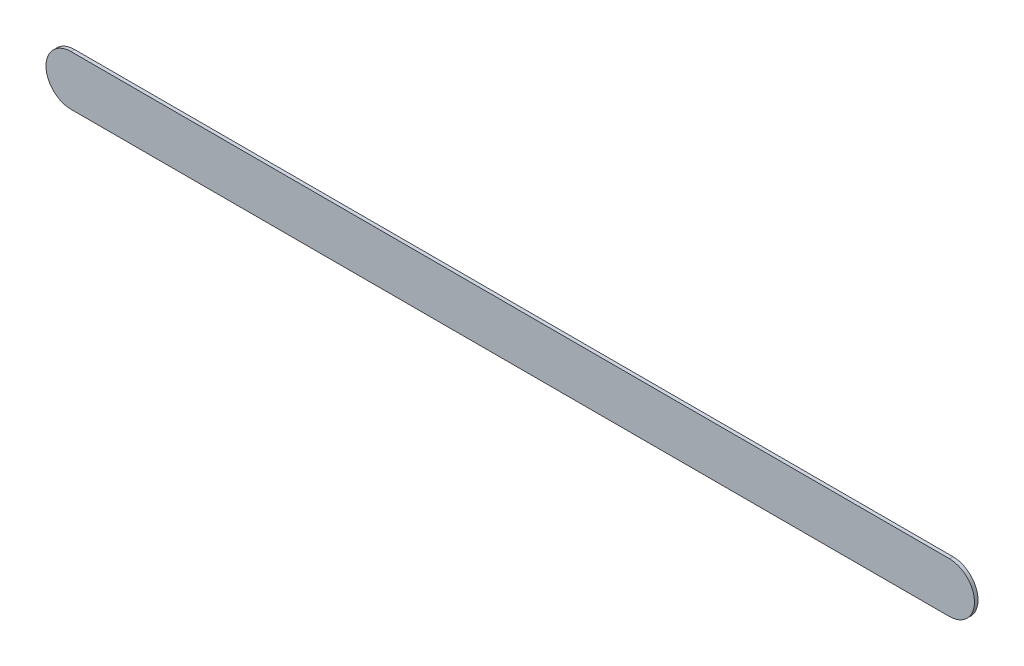
ISO-10303-21;
HEADER;
FILE_DESCRIPTION(('STEP AP214'),'2;1');
FILE_NAME('part.step','',(''),(''),'','','');
FILE_SCHEMA(('AUTOMOTIVE_DESIGN { 1 0 10303 214 1 1 1 1 }'));
ENDSEC;
DATA;
#1=APPLICATION_CONTEXT('core data for automotive mechanical design processes');
#2=APPLICATION_PROTOCOL_DEFINITION('international standard','automotive_design',2000,#1);
#3=PRODUCT_CONTEXT('',#1,'mechanical');
#4=PRODUCT('Part','Part','',(#3));
#5=PRODUCT_RELATED_PRODUCT_CATEGORY('part','',(#4));
#6=PRODUCT_DEFINITION_FORMATION('','',#4);
#7=PRODUCT_DEFINITION_CONTEXT('part definition',#1,'design');
#8=PRODUCT_DEFINITION('design','',#6,#7);
#9=PRODUCT_DEFINITION_SHAPE('','',#8);
#10=(LENGTH_UNIT() NAMED_UNIT(*) SI_UNIT(.MILLI.,.METRE.));
#11=(NAMED_UNIT(*) PLANE_ANGLE_UNIT() SI_UNIT($,.RADIAN.));
#12=(NAMED_UNIT(*) SI_UNIT($,.STERADIAN.) SOLID_ANGLE_UNIT());
#13=UNCERTAINTY_MEASURE_WITH_UNIT(LENGTH_MEASURE(1.E-05),#10,'distance_accuracy_value','');
#14=(GEOMETRIC_REPRESENTATION_CONTEXT(3) GLOBAL_UNCERTAINTY_ASSIGNED_CONTEXT((#13)) GLOBAL_UNIT_ASSIGNED_CONTEXT((#10,
#11,#12)) REPRESENTATION_CONTEXT('',''));
#15=CARTESIAN_POINT('',(0.,0.,0.));
#16=DIRECTION('',(0.,0.,1.));
#17=DIRECTION('',(1.,0.,0.));
#18=AXIS2_PLACEMENT_3D('',#15,#16,#17);
#19=CARTESIAN_POINT('',(92.54500414,105.33201184,0.));
#20=DIRECTION('',(0.,1.,0.));
#21=DIRECTION('',(1.,0.,0.));
#22=AXIS2_PLACEMENT_3D('',#19,#20,#21);
#23=PLANE('',#22);
#24=DIRECTION('',(1.,0.,0.));
#25=VECTOR('',#24,1.);
#26=CARTESIAN_POINT('',(92.54500414,105.33201184,0.03556));
#27=LINE('',#26,#25);
#28=CARTESIAN_POINT('',(92.54500414,105.33201184,0.03556));
#29=VERTEX_POINT('',#28);
#30=CARTESIAN_POINT('',(101.31798888,105.33201184,0.03556));
#31=VERTEX_POINT('',#30);
#32=EDGE_CURVE('E11',#29,#31,#27,.T.);
#33=ORIENTED_EDGE('',*,*,#32,.F.);
#34=DIRECTION('',(0.,0.,1.));
#35=VECTOR('',#34,1.);
#36=CARTESIAN_POINT('',(92.54500414,105.33201184,0.));
#37=LINE('',#36,#35);
#38=CARTESIAN_POINT('',(92.54500414,105.33201184,0.));
#39=VERTEX_POINT('',#38);
#40=EDGE_CURVE('E24',#39,#29,#37,.T.);
#41=ORIENTED_EDGE('',*,*,#40,.F.);
#42=DIRECTION('',(1.,0.,0.));
#43=VECTOR('',#42,1.);
#44=CARTESIAN_POINT('',(92.54500414,105.33201184,0.));
#45=LINE('',#44,#43);
#46=CARTESIAN_POINT('',(101.31798888,105.33201184,0.));
#47=VERTEX_POINT('',#46);
#48=EDGE_CURVE('E75',#39,#47,#45,.T.);
#49=ORIENTED_EDGE('',*,*,#48,.T.);
#50=DIRECTION('',(0.,0.,1.));
#51=VECTOR('',#50,1.);
#52=CARTESIAN_POINT('',(101.31798888,105.33201184,0.));
#53=LINE('',#52,#51);
#54=EDGE_CURVE('E37',#47,#31,#53,.T.);
#55=ORIENTED_EDGE('',*,*,#54,.T.);
#56=EDGE_LOOP('',(#33,#41,#49,#55));
#57=FACE_BOUND('',#56,.T.);
#58=ADVANCED_FACE('F17',(#57),#23,.F.);
#59=CARTESIAN_POINT('',(101.31798888,105.58201134,0.));
#60=DIRECTION('',(0.,0.,-1.));
#61=DIRECTION('',(0.,-1.,0.));
#62=AXIS2_PLACEMENT_3D('',#59,#60,#61);
#63=CYLINDRICAL_SURFACE('',#62,0.249999500000001);
#64=CARTESIAN_POINT('',(101.31798888,105.58201134,0.03556));
#65=DIRECTION('',(0.,0.,1.));
#66=DIRECTION('',(0.,-1.,0.));
#67=AXIS2_PLACEMENT_3D('',#64,#65,#66);
#68=CIRCLE('',#67,0.249999500000001);
#69=CARTESIAN_POINT('',(101.31798888,105.83201084,0.03556));
#70=VERTEX_POINT('',#69);
#71=EDGE_CURVE('E83',#31,#70,#68,.T.);
#72=ORIENTED_EDGE('',*,*,#71,.F.);
#73=ORIENTED_EDGE('',*,*,#54,.F.);
#74=CARTESIAN_POINT('',(101.31798888,105.58201134,0.));
#75=DIRECTION('',(0.,0.,1.));
#76=DIRECTION('',(0.,-1.,0.));
#77=AXIS2_PLACEMENT_3D('',#74,#75,#76);
#78=CIRCLE('',#77,0.249999500000001);
#79=CARTESIAN_POINT('',(101.31798888,105.83201084,0.));
#80=VERTEX_POINT('',#79);
#81=EDGE_CURVE('E81',#47,#80,#78,.T.);
#82=ORIENTED_EDGE('',*,*,#81,.T.);
#83=DIRECTION('',(0.,0.,1.));
#84=VECTOR('',#83,1.);
#85=CARTESIAN_POINT('',(101.31798888,105.83201084,0.));
#86=LINE('',#85,#84);
#87=EDGE_CURVE('E67',#80,#70,#86,.T.);
#88=ORIENTED_EDGE('',*,*,#87,.T.);
#89=EDGE_LOOP('',(#72,#73,#82,#88));
#90=FACE_BOUND('',#89,.T.);
#91=ADVANCED_FACE('F89',(#90),#63,.T.);
#92=CARTESIAN_POINT('',(101.31798888,105.83201084,0.));
#93=DIRECTION('',(0.,-1.,0.));
#94=DIRECTION('',(-1.,0.,0.));
#95=AXIS2_PLACEMENT_3D('',#92,#93,#94);
#96=PLANE('',#95);
#97=DIRECTION('',(-1.,0.,0.));
#98=VECTOR('',#97,1.);
#99=CARTESIAN_POINT('',(101.31798888,105.83201084,0.03556));
#100=LINE('',#99,#98);
#101=CARTESIAN_POINT('',(92.54500414,105.83201084,0.03556));
#102=VERTEX_POINT('',#101);
#103=EDGE_CURVE('E71',#70,#102,#100,.T.);
#104=ORIENTED_EDGE('',*,*,#103,.F.);
#105=ORIENTED_EDGE('',*,*,#87,.F.);
#106=DIRECTION('',(-1.,0.,0.));
#107=VECTOR('',#106,1.);
#108=CARTESIAN_POINT('',(101.31798888,105.83201084,0.));
#109=LINE('',#108,#107);
#110=CARTESIAN_POINT('',(92.54500414,105.83201084,0.));
#111=VERTEX_POINT('',#110);
#112=EDGE_CURVE('E63',#80,#111,#109,.T.);
#113=ORIENTED_EDGE('',*,*,#112,.T.);
#114=DIRECTION('',(0.,0.,1.));
#115=VECTOR('',#114,1.);
#116=CARTESIAN_POINT('',(92.54500414,105.83201084,0.));
#117=LINE('',#116,#115);
#118=EDGE_CURVE('E53',#111,#102,#117,.T.);
#119=ORIENTED_EDGE('',*,*,#118,.T.);
#120=EDGE_LOOP('',(#104,#105,#113,#119));
#121=FACE_BOUND('',#120,.T.);
#122=ADVANCED_FACE('F66',(#121),#96,.F.);
#123=CARTESIAN_POINT('',(92.54500414,105.58201134,0.));
#124=DIRECTION('',(0.,0.,-1.));
#125=DIRECTION('',(0.,1.,0.));
#126=AXIS2_PLACEMENT_3D('',#123,#124,#125);
#127=CYLINDRICAL_SURFACE('',#126,0.249999500000001);
#128=CARTESIAN_POINT('',(92.54500414,105.58201134,0.03556));
#129=DIRECTION('',(0.,0.,1.));
#130=DIRECTION('',(0.,1.,0.));
#131=AXIS2_PLACEMENT_3D('',#128,#129,#130);
#132=CIRCLE('',#131,0.249999500000001);
#133=EDGE_CURVE('E59',#102,#29,#132,.T.);
#134=ORIENTED_EDGE('',*,*,#133,.F.);
#135=ORIENTED_EDGE('',*,*,#118,.F.);
#136=CARTESIAN_POINT('',(92.54500414,105.58201134,0.));
#137=DIRECTION('',(0.,0.,1.));
#138=DIRECTION('',(0.,1.,0.));
#139=AXIS2_PLACEMENT_3D('',#136,#137,#138);
#140=CIRCLE('',#139,0.249999500000001);
#141=EDGE_CURVE('E57',#111,#39,#140,.T.);
#142=ORIENTED_EDGE('',*,*,#141,.T.);
#143=ORIENTED_EDGE('',*,*,#40,.T.);
#144=EDGE_LOOP('',(#134,#135,#142,#143));
#145=FACE_BOUND('',#144,.T.);
#146=ADVANCED_FACE('F55',(#145),#127,.T.);
#147=CARTESIAN_POINT('',(92.54500414,105.33201184,0.));
#148=DIRECTION('',(0.,0.,-1.));
#149=DIRECTION('',(-1.,0.,0.));
#150=AXIS2_PLACEMENT_3D('',#147,#148,#149);
#151=PLANE('',#150);
#152=ORIENTED_EDGE('',*,*,#141,.F.);
#153=ORIENTED_EDGE('',*,*,#112,.F.);
#154=ORIENTED_EDGE('',*,*,#81,.F.);
#155=ORIENTED_EDGE('',*,*,#48,.F.);
#156=EDGE_LOOP('',(#152,#153,#154,#155));
#157=FACE_BOUND('',#156,.T.);
#158=ADVANCED_FACE('F74',(#157),#151,.T.);
#159=CARTESIAN_POINT('',(92.54500414,105.33201184,0.03556));
#160=DIRECTION('',(0.,0.,-1.));
#161=DIRECTION('',(-1.,0.,0.));
#162=AXIS2_PLACEMENT_3D('',#159,#160,#161);
#163=PLANE('',#162);
#164=ORIENTED_EDGE('',*,*,#32,.T.);
#165=ORIENTED_EDGE('',*,*,#71,.T.);
#166=ORIENTED_EDGE('',*,*,#103,.T.);
#167=ORIENTED_EDGE('',*,*,#133,.T.);
#168=EDGE_LOOP('',(#164,#165,#166,#167));
#169=FACE_BOUND('',#168,.T.);
#170=ADVANCED_FACE('F91',(#169),#163,.F.);
#171=CLOSED_SHELL('',(#58,#91,#122,#146,#158,#170));
#172=MANIFOLD_SOLID_BREP('B1',#171);
#173=ADVANCED_BREP_SHAPE_REPRESENTATION('',(#18,#172),#14);
#174=SHAPE_DEFINITION_REPRESENTATION(#9,#173);
ENDSEC;
END-ISO-10303-21;
